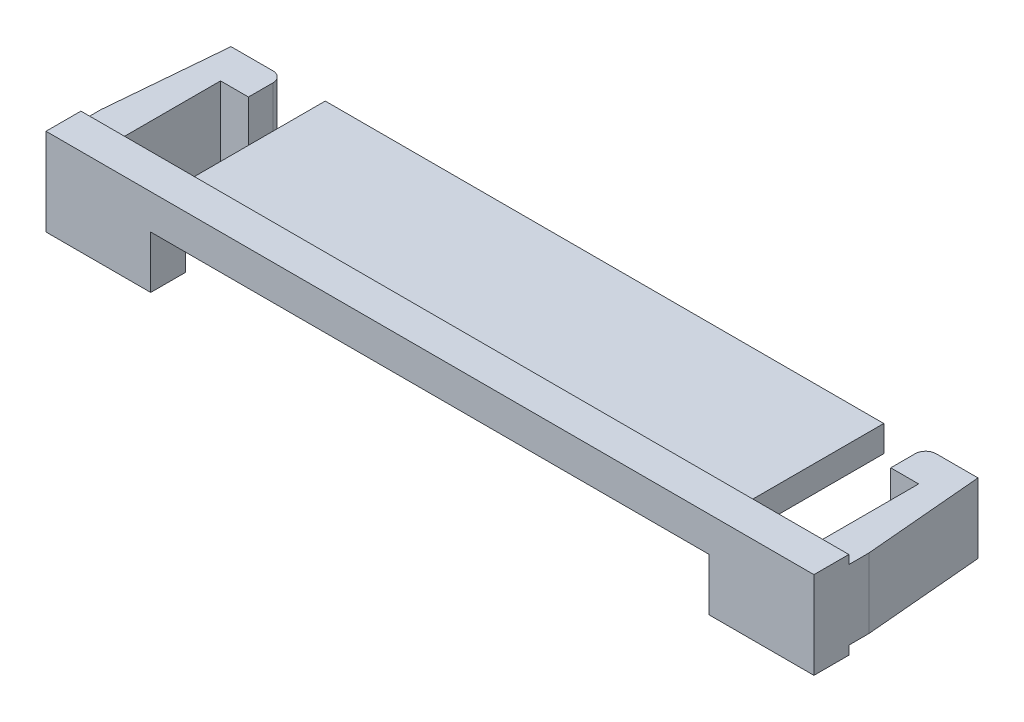
ISO-10303-21;
HEADER;
FILE_DESCRIPTION(('STEP AP214'),'2;1');
FILE_NAME('part.step','',(''),(''),'','','');
FILE_SCHEMA(('AUTOMOTIVE_DESIGN { 1 0 10303 214 1 1 1 1 }'));
ENDSEC;
DATA;
#1=APPLICATION_CONTEXT('core data for automotive mechanical design processes');
#2=APPLICATION_PROTOCOL_DEFINITION('international standard','automotive_design',2000,#1);
#3=PRODUCT_CONTEXT('',#1,'mechanical');
#4=PRODUCT('Part','Part','',(#3));
#5=PRODUCT_RELATED_PRODUCT_CATEGORY('part','',(#4));
#6=PRODUCT_DEFINITION_FORMATION('','',#4);
#7=PRODUCT_DEFINITION_CONTEXT('part definition',#1,'design');
#8=PRODUCT_DEFINITION('design','',#6,#7);
#9=PRODUCT_DEFINITION_SHAPE('','',#8);
#10=(LENGTH_UNIT() NAMED_UNIT(*) SI_UNIT(.MILLI.,.METRE.));
#11=(NAMED_UNIT(*) PLANE_ANGLE_UNIT() SI_UNIT($,.RADIAN.));
#12=(NAMED_UNIT(*) SI_UNIT($,.STERADIAN.) SOLID_ANGLE_UNIT());
#13=UNCERTAINTY_MEASURE_WITH_UNIT(LENGTH_MEASURE(1.E-05),#10,'distance_accuracy_value','');
#14=(GEOMETRIC_REPRESENTATION_CONTEXT(3) GLOBAL_UNCERTAINTY_ASSIGNED_CONTEXT((#13)) GLOBAL_UNIT_ASSIGNED_CONTEXT((#10,
#11,#12)) REPRESENTATION_CONTEXT('',''));
#15=CARTESIAN_POINT('',(0.,0.,0.));
#16=DIRECTION('',(0.,0.,1.));
#17=DIRECTION('',(1.,0.,0.));
#18=AXIS2_PLACEMENT_3D('',#15,#16,#17);
#19=CARTESIAN_POINT('',(-11.,-1.25,5.));
#20=DIRECTION('',(0.,1.,0.));
#21=DIRECTION('',(0.,0.,1.));
#22=AXIS2_PLACEMENT_3D('',#19,#20,#21);
#23=PLANE('',#22);
#24=DIRECTION('',(1.,0.,0.));
#25=VECTOR('',#24,1.);
#26=CARTESIAN_POINT('',(-11.,-1.25,5.));
#27=LINE('',#26,#25);
#28=CARTESIAN_POINT('',(8.,-1.25,5.));
#29=VERTEX_POINT('',#28);
#30=CARTESIAN_POINT('',(11.,-1.25,5.));
#31=VERTEX_POINT('',#30);
#32=EDGE_CURVE('E419',#29,#31,#27,.T.);
#33=ORIENTED_EDGE('',*,*,#32,.F.);
#34=DIRECTION('',(0.,0.,-1.));
#35=VECTOR('',#34,1.);
#36=CARTESIAN_POINT('',(8.,-1.25,5.));
#37=LINE('',#36,#35);
#38=CARTESIAN_POINT('',(8.,-1.25,4.));
#39=VERTEX_POINT('',#38);
#40=EDGE_CURVE('E290',#29,#39,#37,.T.);
#41=ORIENTED_EDGE('',*,*,#40,.T.);
#42=DIRECTION('',(-1.,0.,0.));
#43=VECTOR('',#42,1.);
#44=CARTESIAN_POINT('',(-11.,-1.25,4.));
#45=LINE('',#44,#43);
#46=CARTESIAN_POINT('',(11.,-1.25,4.));
#47=VERTEX_POINT('',#46);
#48=EDGE_CURVE('E397',#47,#39,#45,.T.);
#49=ORIENTED_EDGE('',*,*,#48,.F.);
#50=DIRECTION('',(0.,0.,-1.));
#51=VECTOR('',#50,1.);
#52=CARTESIAN_POINT('',(11.,-1.25,5.));
#53=LINE('',#52,#51);
#54=EDGE_CURVE('E424',#31,#47,#53,.T.);
#55=ORIENTED_EDGE('',*,*,#54,.F.);
#56=EDGE_LOOP('',(#33,#41,#49,#55));
#57=FACE_BOUND('',#56,.T.);
#58=ADVANCED_FACE('F43',(#57),#23,.F.);
#59=CARTESIAN_POINT('',(0.,0.,0.));
#60=DIRECTION('',(0.,0.,1.));
#61=DIRECTION('',(1.,0.,0.));
#62=AXIS2_PLACEMENT_3D('',#59,#60,#61);
#63=PLANE('',#62);
#64=DIRECTION('',(-1.,0.,0.));
#65=VECTOR('',#64,1.);
#66=CARTESIAN_POINT('',(11.,1.,0.));
#67=LINE('',#66,#65);
#68=CARTESIAN_POINT('',(10.7,1.,0.));
#69=VERTEX_POINT('',#68);
#70=CARTESIAN_POINT('',(9.5,1.,0.));
#71=VERTEX_POINT('',#70);
#72=EDGE_CURVE('E358',#69,#71,#67,.T.);
#73=ORIENTED_EDGE('',*,*,#72,.F.);
#74=DIRECTION('',(0.,-1.,0.));
#75=VECTOR('',#74,1.);
#76=CARTESIAN_POINT('',(10.7,0.,0.));
#77=LINE('',#76,#75);
#78=CARTESIAN_POINT('',(10.7,-1.,0.));
#79=VERTEX_POINT('',#78);
#80=EDGE_CURVE('E483',#69,#79,#77,.T.);
#81=ORIENTED_EDGE('',*,*,#80,.T.);
#82=DIRECTION('',(1.,0.,0.));
#83=VECTOR('',#82,1.);
#84=CARTESIAN_POINT('',(-11.,-1.,0.));
#85=LINE('',#84,#83);
#86=CARTESIAN_POINT('',(9.5,-1.,0.));
#87=VERTEX_POINT('',#86);
#88=EDGE_CURVE('E326',#87,#79,#85,.T.);
#89=ORIENTED_EDGE('',*,*,#88,.F.);
#90=DIRECTION('',(0.,1.,0.));
#91=VECTOR('',#90,1.);
#92=CARTESIAN_POINT('',(9.5,1.,0.));
#93=LINE('',#92,#91);
#94=EDGE_CURVE('E451',#87,#71,#93,.T.);
#95=ORIENTED_EDGE('',*,*,#94,.T.);
#96=EDGE_LOOP('',(#73,#81,#89,#95));
#97=FACE_BOUND('',#96,.T.);
#98=ADVANCED_FACE('F585',(#97),#63,.F.);
#99=CARTESIAN_POINT('',(-10.7,-1.,0.));
#100=VERTEX_POINT('',#99);
#101=CARTESIAN_POINT('',(-9.5,-1.,0.));
#102=VERTEX_POINT('',#101);
#103=EDGE_CURVE('E388',#100,#102,#85,.T.);
#104=ORIENTED_EDGE('',*,*,#103,.F.);
#105=DIRECTION('',(0.,1.,0.));
#106=VECTOR('',#105,1.);
#107=CARTESIAN_POINT('',(-10.7,0.,0.));
#108=LINE('',#107,#106);
#109=CARTESIAN_POINT('',(-10.7,1.,0.));
#110=VERTEX_POINT('',#109);
#111=EDGE_CURVE('E52',#100,#110,#108,.T.);
#112=ORIENTED_EDGE('',*,*,#111,.T.);
#113=CARTESIAN_POINT('',(-9.5,1.,0.));
#114=VERTEX_POINT('',#113);
#115=EDGE_CURVE('E374',#114,#110,#67,.T.);
#116=ORIENTED_EDGE('',*,*,#115,.F.);
#117=DIRECTION('',(0.,1.,0.));
#118=VECTOR('',#117,1.);
#119=CARTESIAN_POINT('',(-9.5,-1.,0.));
#120=LINE('',#119,#118);
#121=EDGE_CURVE('E469',#114,#102,#120,.F.);
#122=ORIENTED_EDGE('',*,*,#121,.T.);
#123=EDGE_LOOP('',(#104,#112,#116,#122));
#124=FACE_BOUND('',#123,.T.);
#125=ADVANCED_FACE('F590',(#124),#63,.F.);
#126=CARTESIAN_POINT('',(-11.,-1.,4.));
#127=DIRECTION('',(0.,1.,0.));
#128=DIRECTION('',(-1.,0.,0.));
#129=AXIS2_PLACEMENT_3D('',#126,#127,#128);
#130=PLANE('',#129);
#131=ORIENTED_EDGE('',*,*,#88,.T.);
#132=DIRECTION('',(-0.0871557427476589,0.,-0.996194698091746));
#133=VECTOR('',#132,1.);
#134=CARTESIAN_POINT('',(11.,-1.,3.42901569082837));
#135=LINE('',#134,#133);
#136=CARTESIAN_POINT('',(11.,-1.,3.42901569082837));
#137=VERTEX_POINT('',#136);
#138=EDGE_CURVE('E486',#79,#137,#135,.F.);
#139=ORIENTED_EDGE('',*,*,#138,.T.);
#140=DIRECTION('',(0.,0.,-1.));
#141=VECTOR('',#140,1.);
#142=CARTESIAN_POINT('',(11.,-1.,4.));
#143=LINE('',#142,#141);
#144=CARTESIAN_POINT('',(11.,-1.,4.));
#145=VERTEX_POINT('',#144);
#146=EDGE_CURVE('E404',#145,#137,#143,.T.);
#147=ORIENTED_EDGE('',*,*,#146,.F.);
#148=DIRECTION('',(1.,0.,0.));
#149=VECTOR('',#148,1.);
#150=CARTESIAN_POINT('',(-11.,-1.,4.));
#151=LINE('',#150,#149);
#152=CARTESIAN_POINT('',(10.,-1.,4.));
#153=VERTEX_POINT('',#152);
#154=EDGE_CURVE('E387',#153,#145,#151,.T.);
#155=ORIENTED_EDGE('',*,*,#154,.F.);
#156=DIRECTION('',(0.,0.,-1.));
#157=VECTOR('',#156,1.);
#158=CARTESIAN_POINT('',(10.,-1.,4.));
#159=LINE('',#158,#157);
#160=CARTESIAN_POINT('',(10.,-1.,1.));
#161=VERTEX_POINT('',#160);
#162=EDGE_CURVE('E249',#153,#161,#159,.T.);
#163=ORIENTED_EDGE('',*,*,#162,.T.);
#164=DIRECTION('',(1.,0.,0.));
#165=VECTOR('',#164,1.);
#166=CARTESIAN_POINT('',(11.,-1.,1.));
#167=LINE('',#166,#165);
#168=CARTESIAN_POINT('',(9.2,-1.,1.));
#169=VERTEX_POINT('',#168);
#170=EDGE_CURVE('E234',#169,#161,#167,.T.);
#171=ORIENTED_EDGE('',*,*,#170,.F.);
#172=DIRECTION('',(0.,0.,1.));
#173=VECTOR('',#172,1.);
#174=CARTESIAN_POINT('',(9.2,-1.,0.));
#175=LINE('',#174,#173);
#176=CARTESIAN_POINT('',(9.2,-1.,0.3));
#177=VERTEX_POINT('',#176);
#178=EDGE_CURVE('E222',#177,#169,#175,.T.);
#179=ORIENTED_EDGE('',*,*,#178,.F.);
#180=CARTESIAN_POINT('',(9.5,-1.,0.3));
#181=DIRECTION('',(0.,1.,0.));
#182=DIRECTION('',(-1.,0.,0.));
#183=AXIS2_PLACEMENT_3D('',#180,#181,#182);
#184=CIRCLE('',#183,0.3);
#185=EDGE_CURVE('E460',#177,#87,#184,.F.);
#186=ORIENTED_EDGE('',*,*,#185,.T.);
#187=EDGE_LOOP('',(#131,#139,#147,#155,#163,#171,#179,#186));
#188=FACE_BOUND('',#187,.T.);
#189=ADVANCED_FACE('F247',(#188),#130,.F.);
#190=DIRECTION('',(0.,0.,-1.));
#191=VECTOR('',#190,1.);
#192=CARTESIAN_POINT('',(-11.,-1.,4.));
#193=LINE('',#192,#191);
#194=CARTESIAN_POINT('',(-11.,-1.,4.));
#195=VERTEX_POINT('',#194);
#196=CARTESIAN_POINT('',(-11.,-1.,3.42901569082837));
#197=VERTEX_POINT('',#196);
#198=EDGE_CURVE('E401',#195,#197,#193,.T.);
#199=ORIENTED_EDGE('',*,*,#198,.T.);
#200=DIRECTION('',(-0.0871557427476589,0.,0.996194698091746));
#201=VECTOR('',#200,1.);
#202=CARTESIAN_POINT('',(-11.,-1.,3.42901569082837));
#203=LINE('',#202,#201);
#204=EDGE_CURVE('E66',#197,#100,#203,.F.);
#205=ORIENTED_EDGE('',*,*,#204,.T.);
#206=ORIENTED_EDGE('',*,*,#103,.T.);
#207=CARTESIAN_POINT('',(-9.5,-1.,0.3));
#208=DIRECTION('',(0.,1.,0.));
#209=DIRECTION('',(-1.,0.,0.));
#210=AXIS2_PLACEMENT_3D('',#207,#208,#209);
#211=CIRCLE('',#210,0.3);
#212=CARTESIAN_POINT('',(-9.2,-1.,0.3));
#213=VERTEX_POINT('',#212);
#214=EDGE_CURVE('E473',#102,#213,#211,.F.);
#215=ORIENTED_EDGE('',*,*,#214,.T.);
#216=DIRECTION('',(0.,0.,-1.));
#217=VECTOR('',#216,1.);
#218=CARTESIAN_POINT('',(-9.2,-1.,0.));
#219=LINE('',#218,#217);
#220=CARTESIAN_POINT('',(-9.2,-1.,1.));
#221=VERTEX_POINT('',#220);
#222=EDGE_CURVE('E263',#221,#213,#219,.T.);
#223=ORIENTED_EDGE('',*,*,#222,.F.);
#224=DIRECTION('',(1.,0.,0.));
#225=VECTOR('',#224,1.);
#226=CARTESIAN_POINT('',(-11.,-1.,1.));
#227=LINE('',#226,#225);
#228=CARTESIAN_POINT('',(-9.99999999999999,-1.,1.));
#229=VERTEX_POINT('',#228);
#230=EDGE_CURVE('E260',#229,#221,#227,.T.);
#231=ORIENTED_EDGE('',*,*,#230,.F.);
#232=DIRECTION('',(0.,0.,-1.));
#233=VECTOR('',#232,1.);
#234=CARTESIAN_POINT('',(-9.99999999999999,-1.,4.));
#235=LINE('',#234,#233);
#236=CARTESIAN_POINT('',(-9.99999999999999,-1.,4.));
#237=VERTEX_POINT('',#236);
#238=EDGE_CURVE('E322',#237,#229,#235,.T.);
#239=ORIENTED_EDGE('',*,*,#238,.F.);
#240=EDGE_CURVE('E389',#195,#237,#151,.T.);
#241=ORIENTED_EDGE('',*,*,#240,.F.);
#242=EDGE_LOOP('',(#199,#205,#206,#215,#223,#231,#239,#241));
#243=FACE_BOUND('',#242,.T.);
#244=ADVANCED_FACE('F552',(#243),#130,.F.);
#245=CARTESIAN_POINT('',(11.,1.,4.));
#246=DIRECTION('',(0.,-1.,0.));
#247=DIRECTION('',(0.,0.,-1.));
#248=AXIS2_PLACEMENT_3D('',#245,#246,#247);
#249=PLANE('',#248);
#250=DIRECTION('',(0.,0.,-1.));
#251=VECTOR('',#250,1.);
#252=CARTESIAN_POINT('',(11.,1.,4.));
#253=LINE('',#252,#251);
#254=CARTESIAN_POINT('',(11.,1.,4.));
#255=VERTEX_POINT('',#254);
#256=CARTESIAN_POINT('',(11.,1.,3.42901569082837));
#257=VERTEX_POINT('',#256);
#258=EDGE_CURVE('E370',#255,#257,#253,.T.);
#259=ORIENTED_EDGE('',*,*,#258,.T.);
#260=DIRECTION('',(0.0871557427476589,0.,0.996194698091746));
#261=VECTOR('',#260,1.);
#262=CARTESIAN_POINT('',(11.,1.,3.42901569082837));
#263=LINE('',#262,#261);
#264=EDGE_CURVE('E480',#257,#69,#263,.F.);
#265=ORIENTED_EDGE('',*,*,#264,.T.);
#266=ORIENTED_EDGE('',*,*,#72,.T.);
#267=CARTESIAN_POINT('',(9.5,1.,0.3));
#268=DIRECTION('',(0.,-1.,0.));
#269=DIRECTION('',(0.,0.,-1.));
#270=AXIS2_PLACEMENT_3D('',#267,#268,#269);
#271=CIRCLE('',#270,0.3);
#272=CARTESIAN_POINT('',(9.2,1.,0.3));
#273=VERTEX_POINT('',#272);
#274=EDGE_CURVE('E455',#71,#273,#271,.F.);
#275=ORIENTED_EDGE('',*,*,#274,.T.);
#276=DIRECTION('',(0.,0.,1.));
#277=VECTOR('',#276,1.);
#278=CARTESIAN_POINT('',(9.2,1.,0.));
#279=LINE('',#278,#277);
#280=CARTESIAN_POINT('',(9.2,1.,1.));
#281=VERTEX_POINT('',#280);
#282=EDGE_CURVE('E255',#273,#281,#279,.T.);
#283=ORIENTED_EDGE('',*,*,#282,.T.);
#284=DIRECTION('',(1.,0.,0.));
#285=VECTOR('',#284,1.);
#286=CARTESIAN_POINT('',(11.,1.,1.));
#287=LINE('',#286,#285);
#288=CARTESIAN_POINT('',(10.,1.,1.));
#289=VERTEX_POINT('',#288);
#290=EDGE_CURVE('E235',#281,#289,#287,.T.);
#291=ORIENTED_EDGE('',*,*,#290,.T.);
#292=DIRECTION('',(0.,0.,-1.));
#293=VECTOR('',#292,1.);
#294=CARTESIAN_POINT('',(10.,1.,4.));
#295=LINE('',#294,#293);
#296=CARTESIAN_POINT('',(10.,1.,4.));
#297=VERTEX_POINT('',#296);
#298=EDGE_CURVE('E323',#297,#289,#295,.T.);
#299=ORIENTED_EDGE('',*,*,#298,.F.);
#300=DIRECTION('',(-1.,0.,0.));
#301=VECTOR('',#300,1.);
#302=CARTESIAN_POINT('',(11.,1.,4.));
#303=LINE('',#302,#301);
#304=EDGE_CURVE('E359',#255,#297,#303,.T.);
#305=ORIENTED_EDGE('',*,*,#304,.F.);
#306=EDGE_LOOP('',(#259,#265,#266,#275,#283,#291,#299,#305));
#307=FACE_BOUND('',#306,.T.);
#308=ADVANCED_FACE('F574',(#307),#249,.F.);
#309=ORIENTED_EDGE('',*,*,#115,.T.);
#310=DIRECTION('',(0.0871557427476589,0.,-0.996194698091746));
#311=VECTOR('',#310,1.);
#312=CARTESIAN_POINT('',(-11.,1.,3.42901569082837));
#313=LINE('',#312,#311);
#314=CARTESIAN_POINT('',(-11.,1.,3.42901569082837));
#315=VERTEX_POINT('',#314);
#316=EDGE_CURVE('E11',#110,#315,#313,.F.);
#317=ORIENTED_EDGE('',*,*,#316,.T.);
#318=DIRECTION('',(0.,0.,-1.));
#319=VECTOR('',#318,1.);
#320=CARTESIAN_POINT('',(-11.,1.,4.));
#321=LINE('',#320,#319);
#322=CARTESIAN_POINT('',(-11.,1.,4.));
#323=VERTEX_POINT('',#322);
#324=EDGE_CURVE('E375',#323,#315,#321,.T.);
#325=ORIENTED_EDGE('',*,*,#324,.F.);
#326=CARTESIAN_POINT('',(-9.99999999999999,1.,4.));
#327=VERTEX_POINT('',#326);
#328=EDGE_CURVE('E357',#327,#323,#303,.T.);
#329=ORIENTED_EDGE('',*,*,#328,.F.);
#330=DIRECTION('',(0.,0.,-1.));
#331=VECTOR('',#330,1.);
#332=CARTESIAN_POINT('',(-9.99999999999999,1.,4.));
#333=LINE('',#332,#331);
#334=CARTESIAN_POINT('',(-9.99999999999999,1.,1.));
#335=VERTEX_POINT('',#334);
#336=EDGE_CURVE('E340',#327,#335,#333,.T.);
#337=ORIENTED_EDGE('',*,*,#336,.T.);
#338=DIRECTION('',(1.,0.,0.));
#339=VECTOR('',#338,1.);
#340=CARTESIAN_POINT('',(-11.,1.,1.));
#341=LINE('',#340,#339);
#342=CARTESIAN_POINT('',(-9.2,1.,1.));
#343=VERTEX_POINT('',#342);
#344=EDGE_CURVE('E243',#335,#343,#341,.T.);
#345=ORIENTED_EDGE('',*,*,#344,.T.);
#346=DIRECTION('',(0.,0.,-1.));
#347=VECTOR('',#346,1.);
#348=CARTESIAN_POINT('',(-9.2,1.,0.));
#349=LINE('',#348,#347);
#350=CARTESIAN_POINT('',(-9.2,1.,0.3));
#351=VERTEX_POINT('',#350);
#352=EDGE_CURVE('E264',#343,#351,#349,.T.);
#353=ORIENTED_EDGE('',*,*,#352,.T.);
#354=CARTESIAN_POINT('',(-9.5,1.,0.3));
#355=DIRECTION('',(0.,-1.,0.));
#356=DIRECTION('',(0.,0.,-1.));
#357=AXIS2_PLACEMENT_3D('',#354,#355,#356);
#358=CIRCLE('',#357,0.3);
#359=EDGE_CURVE('E466',#351,#114,#358,.F.);
#360=ORIENTED_EDGE('',*,*,#359,.T.);
#361=EDGE_LOOP('',(#309,#317,#325,#329,#337,#345,#353,#360));
#362=FACE_BOUND('',#361,.T.);
#363=ADVANCED_FACE('F560',(#362),#249,.F.);
#364=CARTESIAN_POINT('',(-11.,1.25,5.));
#365=DIRECTION('',(0.,-1.,0.));
#366=DIRECTION('',(0.,0.,-1.));
#367=AXIS2_PLACEMENT_3D('',#364,#365,#366);
#368=PLANE('',#367);
#369=DIRECTION('',(1.,0.,0.));
#370=VECTOR('',#369,1.);
#371=CARTESIAN_POINT('',(11.,1.25,4.));
#372=LINE('',#371,#370);
#373=CARTESIAN_POINT('',(-11.,1.25,4.));
#374=VERTEX_POINT('',#373);
#375=CARTESIAN_POINT('',(11.,1.25,4.));
#376=VERTEX_POINT('',#375);
#377=EDGE_CURVE('E367',#374,#376,#372,.T.);
#378=ORIENTED_EDGE('',*,*,#377,.F.);
#379=DIRECTION('',(0.,0.,-1.));
#380=VECTOR('',#379,1.);
#381=CARTESIAN_POINT('',(-11.,1.25,5.));
#382=LINE('',#381,#380);
#383=CARTESIAN_POINT('',(-11.,1.25,5.));
#384=VERTEX_POINT('',#383);
#385=EDGE_CURVE('E432',#384,#374,#382,.T.);
#386=ORIENTED_EDGE('',*,*,#385,.F.);
#387=DIRECTION('',(-1.,0.,0.));
#388=VECTOR('',#387,1.);
#389=CARTESIAN_POINT('',(-11.,1.25,5.));
#390=LINE('',#389,#388);
#391=CARTESIAN_POINT('',(11.,1.25,5.));
#392=VERTEX_POINT('',#391);
#393=EDGE_CURVE('E413',#392,#384,#390,.T.);
#394=ORIENTED_EDGE('',*,*,#393,.F.);
#395=DIRECTION('',(0.,0.,-1.));
#396=VECTOR('',#395,1.);
#397=CARTESIAN_POINT('',(11.,1.25,5.));
#398=LINE('',#397,#396);
#399=EDGE_CURVE('E436',#392,#376,#398,.T.);
#400=ORIENTED_EDGE('',*,*,#399,.T.);
#401=EDGE_LOOP('',(#378,#386,#394,#400));
#402=FACE_BOUND('',#401,.T.);
#403=ADVANCED_FACE('F566',(#402),#368,.F.);
#404=CARTESIAN_POINT('',(-7.99999999999999,-1.25,4.));
#405=VERTEX_POINT('',#404);
#406=CARTESIAN_POINT('',(-11.,-1.25,4.));
#407=VERTEX_POINT('',#406);
#408=EDGE_CURVE('E396',#405,#407,#45,.T.);
#409=ORIENTED_EDGE('',*,*,#408,.F.);
#410=DIRECTION('',(0.,0.,-1.));
#411=VECTOR('',#410,1.);
#412=CARTESIAN_POINT('',(-7.99999999999999,-1.25,5.));
#413=LINE('',#412,#411);
#414=CARTESIAN_POINT('',(-7.99999999999999,-1.25,5.));
#415=VERTEX_POINT('',#414);
#416=EDGE_CURVE('E303',#415,#405,#413,.T.);
#417=ORIENTED_EDGE('',*,*,#416,.F.);
#418=CARTESIAN_POINT('',(-11.,-1.25,5.));
#419=VERTEX_POINT('',#418);
#420=EDGE_CURVE('E420',#419,#415,#27,.T.);
#421=ORIENTED_EDGE('',*,*,#420,.F.);
#422=DIRECTION('',(0.,0.,-1.));
#423=VECTOR('',#422,1.);
#424=CARTESIAN_POINT('',(-11.,-1.25,5.));
#425=LINE('',#424,#423);
#426=EDGE_CURVE('E428',#419,#407,#425,.T.);
#427=ORIENTED_EDGE('',*,*,#426,.T.);
#428=EDGE_LOOP('',(#409,#417,#421,#427));
#429=FACE_BOUND('',#428,.T.);
#430=ADVANCED_FACE('F544',(#429),#23,.F.);
#431=CARTESIAN_POINT('',(11.,1.25,5.));
#432=DIRECTION('',(-1.,0.,0.));
#433=DIRECTION('',(0.,0.,1.));
#434=AXIS2_PLACEMENT_3D('',#431,#432,#433);
#435=PLANE('',#434);
#436=ORIENTED_EDGE('',*,*,#146,.T.);
#437=DIRECTION('',(0.,1.,0.));
#438=VECTOR('',#437,1.);
#439=CARTESIAN_POINT('',(11.,1.25,3.42901569082837));
#440=LINE('',#439,#438);
#441=EDGE_CURVE('E476',#137,#257,#440,.T.);
#442=ORIENTED_EDGE('',*,*,#441,.T.);
#443=ORIENTED_EDGE('',*,*,#258,.F.);
#444=DIRECTION('',(0.,-1.,0.));
#445=VECTOR('',#444,1.);
#446=CARTESIAN_POINT('',(11.,1.25,4.));
#447=LINE('',#446,#445);
#448=EDGE_CURVE('E353',#376,#255,#447,.T.);
#449=ORIENTED_EDGE('',*,*,#448,.F.);
#450=ORIENTED_EDGE('',*,*,#399,.F.);
#451=DIRECTION('',(0.,1.,0.));
#452=VECTOR('',#451,1.);
#453=CARTESIAN_POINT('',(11.,1.25,5.));
#454=LINE('',#453,#452);
#455=EDGE_CURVE('E379',#31,#392,#454,.T.);
#456=ORIENTED_EDGE('',*,*,#455,.F.);
#457=ORIENTED_EDGE('',*,*,#54,.T.);
#458=DIRECTION('',(0.,-1.,0.));
#459=VECTOR('',#458,1.);
#460=CARTESIAN_POINT('',(11.,-1.25,4.));
#461=LINE('',#460,#459);
#462=EDGE_CURVE('E393',#145,#47,#461,.T.);
#463=ORIENTED_EDGE('',*,*,#462,.F.);
#464=EDGE_LOOP('',(#436,#442,#443,#449,#450,#456,#457,#463));
#465=FACE_BOUND('',#464,.T.);
#466=ADVANCED_FACE('F570',(#465),#435,.F.);
#467=CARTESIAN_POINT('',(-11.,1.25,5.));
#468=DIRECTION('',(1.,0.,0.));
#469=DIRECTION('',(0.,0.,-1.));
#470=AXIS2_PLACEMENT_3D('',#467,#468,#469);
#471=PLANE('',#470);
#472=ORIENTED_EDGE('',*,*,#324,.T.);
#473=DIRECTION('',(0.,-1.,0.));
#474=VECTOR('',#473,1.);
#475=CARTESIAN_POINT('',(-11.,1.25,3.42901569082837));
#476=LINE('',#475,#474);
#477=EDGE_CURVE('E489',#315,#197,#476,.T.);
#478=ORIENTED_EDGE('',*,*,#477,.T.);
#479=ORIENTED_EDGE('',*,*,#198,.F.);
#480=DIRECTION('',(0.,1.,0.));
#481=VECTOR('',#480,1.);
#482=CARTESIAN_POINT('',(-11.,-1.25,4.));
#483=LINE('',#482,#481);
#484=EDGE_CURVE('E383',#407,#195,#483,.T.);
#485=ORIENTED_EDGE('',*,*,#484,.F.);
#486=ORIENTED_EDGE('',*,*,#426,.F.);
#487=DIRECTION('',(0.,-1.,0.));
#488=VECTOR('',#487,1.);
#489=CARTESIAN_POINT('',(-11.,1.25,5.));
#490=LINE('',#489,#488);
#491=EDGE_CURVE('E416',#384,#419,#490,.T.);
#492=ORIENTED_EDGE('',*,*,#491,.F.);
#493=ORIENTED_EDGE('',*,*,#385,.T.);
#494=DIRECTION('',(0.,1.,0.));
#495=VECTOR('',#494,1.);
#496=CARTESIAN_POINT('',(-11.,1.25,4.));
#497=LINE('',#496,#495);
#498=EDGE_CURVE('E363',#323,#374,#497,.T.);
#499=ORIENTED_EDGE('',*,*,#498,.F.);
#500=EDGE_LOOP('',(#472,#478,#479,#485,#486,#492,#493,#499));
#501=FACE_BOUND('',#500,.T.);
#502=ADVANCED_FACE('F549',(#501),#471,.F.);
#503=CARTESIAN_POINT('',(0.,0.,5.));
#504=DIRECTION('',(0.,0.,1.));
#505=DIRECTION('',(1.,0.,0.));
#506=AXIS2_PLACEMENT_3D('',#503,#504,#505);
#507=PLANE('',#506);
#508=DIRECTION('',(0.,-1.,0.));
#509=VECTOR('',#508,1.);
#510=CARTESIAN_POINT('',(8.,0.25,5.));
#511=LINE('',#510,#509);
#512=CARTESIAN_POINT('',(8.,0.25,5.));
#513=VERTEX_POINT('',#512);
#514=EDGE_CURVE('E278',#513,#29,#511,.T.);
#515=ORIENTED_EDGE('',*,*,#514,.T.);
#516=ORIENTED_EDGE('',*,*,#32,.T.);
#517=ORIENTED_EDGE('',*,*,#455,.T.);
#518=ORIENTED_EDGE('',*,*,#393,.T.);
#519=ORIENTED_EDGE('',*,*,#491,.T.);
#520=ORIENTED_EDGE('',*,*,#420,.T.);
#521=DIRECTION('',(0.,1.,0.));
#522=VECTOR('',#521,1.);
#523=CARTESIAN_POINT('',(-7.99999999999999,0.25,5.));
#524=LINE('',#523,#522);
#525=CARTESIAN_POINT('',(-7.99999999999999,0.25,5.));
#526=VERTEX_POINT('',#525);
#527=EDGE_CURVE('E282',#415,#526,#524,.T.);
#528=ORIENTED_EDGE('',*,*,#527,.T.);
#529=DIRECTION('',(1.,0.,0.));
#530=VECTOR('',#529,1.);
#531=CARTESIAN_POINT('',(8.,0.25,5.));
#532=LINE('',#531,#530);
#533=EDGE_CURVE('E286',#526,#513,#532,.T.);
#534=ORIENTED_EDGE('',*,*,#533,.T.);
#535=EDGE_LOOP('',(#515,#516,#517,#518,#519,#520,#528,#534));
#536=FACE_BOUND('',#535,.T.);
#537=ADVANCED_FACE('F537',(#536),#507,.T.);
#538=DIRECTION('',(0.,1.,0.));
#539=VECTOR('',#538,1.);
#540=CARTESIAN_POINT('',(8.,1.,0.));
#541=LINE('',#540,#539);
#542=CARTESIAN_POINT('',(8.,0.25,0.));
#543=VERTEX_POINT('',#542);
#544=CARTESIAN_POINT('',(8.,1.,0.));
#545=VERTEX_POINT('',#544);
#546=EDGE_CURVE('E315',#543,#545,#541,.T.);
#547=ORIENTED_EDGE('',*,*,#546,.F.);
#548=DIRECTION('',(1.,0.,0.));
#549=VECTOR('',#548,1.);
#550=CARTESIAN_POINT('',(8.,0.25,0.));
#551=LINE('',#550,#549);
#552=CARTESIAN_POINT('',(-7.99999999999999,0.25,0.));
#553=VERTEX_POINT('',#552);
#554=EDGE_CURVE('E277',#553,#543,#551,.T.);
#555=ORIENTED_EDGE('',*,*,#554,.F.);
#556=DIRECTION('',(0.,-1.,0.));
#557=VECTOR('',#556,1.);
#558=CARTESIAN_POINT('',(-7.99999999999999,1.,0.));
#559=LINE('',#558,#557);
#560=CARTESIAN_POINT('',(-7.99999999999999,1.,0.));
#561=VERTEX_POINT('',#560);
#562=EDGE_CURVE('E297',#561,#553,#559,.T.);
#563=ORIENTED_EDGE('',*,*,#562,.F.);
#564=EDGE_CURVE('E373',#545,#561,#67,.T.);
#565=ORIENTED_EDGE('',*,*,#564,.F.);
#566=EDGE_LOOP('',(#547,#555,#563,#565));
#567=FACE_BOUND('',#566,.T.);
#568=ADVANCED_FACE('F518',(#567),#63,.F.);
#569=CARTESIAN_POINT('',(8.,1.,4.));
#570=VERTEX_POINT('',#569);
#571=CARTESIAN_POINT('',(-7.99999999999999,1.,4.));
#572=VERTEX_POINT('',#571);
#573=EDGE_CURVE('E364',#570,#572,#303,.T.);
#574=ORIENTED_EDGE('',*,*,#573,.F.);
#575=DIRECTION('',(0.,0.,-1.));
#576=VECTOR('',#575,1.);
#577=CARTESIAN_POINT('',(8.,1.,4.));
#578=LINE('',#577,#576);
#579=EDGE_CURVE('E327',#570,#545,#578,.T.);
#580=ORIENTED_EDGE('',*,*,#579,.T.);
#581=ORIENTED_EDGE('',*,*,#564,.T.);
#582=DIRECTION('',(0.,0.,-1.));
#583=VECTOR('',#582,1.);
#584=CARTESIAN_POINT('',(-7.99999999999999,1.,4.));
#585=LINE('',#584,#583);
#586=EDGE_CURVE('E347',#572,#561,#585,.T.);
#587=ORIENTED_EDGE('',*,*,#586,.F.);
#588=EDGE_LOOP('',(#574,#580,#581,#587));
#589=FACE_BOUND('',#588,.T.);
#590=ADVANCED_FACE('F513',(#589),#249,.F.);
#591=CARTESIAN_POINT('',(0.,0.,4.));
#592=DIRECTION('',(0.,0.,-1.));
#593=DIRECTION('',(-1.,0.,0.));
#594=AXIS2_PLACEMENT_3D('',#591,#592,#593);
#595=PLANE('',#594);
#596=ORIENTED_EDGE('',*,*,#48,.T.);
#597=DIRECTION('',(0.,1.,0.));
#598=VECTOR('',#597,1.);
#599=CARTESIAN_POINT('',(8.,1.,4.));
#600=LINE('',#599,#598);
#601=CARTESIAN_POINT('',(8.,0.25,4.));
#602=VERTEX_POINT('',#601);
#603=EDGE_CURVE('E316',#39,#602,#600,.T.);
#604=ORIENTED_EDGE('',*,*,#603,.T.);
#605=EDGE_CURVE('E314',#602,#570,#600,.T.);
#606=ORIENTED_EDGE('',*,*,#605,.T.);
#607=ORIENTED_EDGE('',*,*,#573,.T.);
#608=DIRECTION('',(0.,-1.,0.));
#609=VECTOR('',#608,1.);
#610=CARTESIAN_POINT('',(-7.99999999999999,1.,4.));
#611=LINE('',#610,#609);
#612=CARTESIAN_POINT('',(-7.99999999999999,0.25,4.));
#613=VERTEX_POINT('',#612);
#614=EDGE_CURVE('E336',#572,#613,#611,.T.);
#615=ORIENTED_EDGE('',*,*,#614,.T.);
#616=EDGE_CURVE('E335',#613,#405,#611,.T.);
#617=ORIENTED_EDGE('',*,*,#616,.T.);
#618=ORIENTED_EDGE('',*,*,#408,.T.);
#619=ORIENTED_EDGE('',*,*,#484,.T.);
#620=ORIENTED_EDGE('',*,*,#240,.T.);
#621=DIRECTION('',(0.,1.,0.));
#622=VECTOR('',#621,1.);
#623=CARTESIAN_POINT('',(-9.99999999999999,1.,4.));
#624=LINE('',#623,#622);
#625=EDGE_CURVE('E332',#237,#327,#624,.T.);
#626=ORIENTED_EDGE('',*,*,#625,.T.);
#627=ORIENTED_EDGE('',*,*,#328,.T.);
#628=ORIENTED_EDGE('',*,*,#498,.T.);
#629=ORIENTED_EDGE('',*,*,#377,.T.);
#630=ORIENTED_EDGE('',*,*,#448,.T.);
#631=ORIENTED_EDGE('',*,*,#304,.T.);
#632=DIRECTION('',(0.,-1.,0.));
#633=VECTOR('',#632,1.);
#634=CARTESIAN_POINT('',(10.,1.,4.));
#635=LINE('',#634,#633);
#636=EDGE_CURVE('E310',#297,#153,#635,.T.);
#637=ORIENTED_EDGE('',*,*,#636,.T.);
#638=ORIENTED_EDGE('',*,*,#154,.T.);
#639=ORIENTED_EDGE('',*,*,#462,.T.);
#640=EDGE_LOOP('',(#596,#604,#606,#607,#615,#617,#618,#619,#620,#626,#627,#628,#629,#630,#631,
#637,#638,#639));
#641=FACE_BOUND('',#640,.T.);
#642=ADVANCED_FACE('F524',(#641),#595,.T.);
#643=CARTESIAN_POINT('',(-9.99999999999999,1.,4.));
#644=DIRECTION('',(-1.,0.,0.));
#645=DIRECTION('',(0.,0.,1.));
#646=AXIS2_PLACEMENT_3D('',#643,#644,#645);
#647=PLANE('',#646);
#648=ORIENTED_EDGE('',*,*,#238,.T.);
#649=DIRECTION('',(0.,1.,0.));
#650=VECTOR('',#649,1.);
#651=CARTESIAN_POINT('',(-9.99999999999999,1.,1.));
#652=LINE('',#651,#650);
#653=EDGE_CURVE('E444',#229,#335,#652,.T.);
#654=ORIENTED_EDGE('',*,*,#653,.T.);
#655=ORIENTED_EDGE('',*,*,#336,.F.);
#656=ORIENTED_EDGE('',*,*,#625,.F.);
#657=EDGE_LOOP('',(#648,#654,#655,#656));
#658=FACE_BOUND('',#657,.T.);
#659=ADVANCED_FACE('F559',(#658),#647,.F.);
#660=CARTESIAN_POINT('',(-7.99999999999999,1.,4.));
#661=DIRECTION('',(1.,0.,0.));
#662=DIRECTION('',(0.,0.,-1.));
#663=AXIS2_PLACEMENT_3D('',#660,#661,#662);
#664=PLANE('',#663);
#665=ORIENTED_EDGE('',*,*,#562,.T.);
#666=DIRECTION('',(0.,0.,-1.));
#667=VECTOR('',#666,1.);
#668=CARTESIAN_POINT('',(-7.99999999999999,0.25,5.));
#669=LINE('',#668,#667);
#670=EDGE_CURVE('E302',#613,#553,#669,.T.);
#671=ORIENTED_EDGE('',*,*,#670,.F.);
#672=ORIENTED_EDGE('',*,*,#614,.F.);
#673=ORIENTED_EDGE('',*,*,#586,.T.);
#674=EDGE_LOOP('',(#665,#671,#672,#673));
#675=FACE_BOUND('',#674,.T.);
#676=ADVANCED_FACE('F522',(#675),#664,.F.);
#677=CARTESIAN_POINT('',(10.,1.,4.));
#678=DIRECTION('',(1.,0.,0.));
#679=DIRECTION('',(0.,0.,-1.));
#680=AXIS2_PLACEMENT_3D('',#677,#678,#679);
#681=PLANE('',#680);
#682=ORIENTED_EDGE('',*,*,#298,.T.);
#683=DIRECTION('',(0.,-1.,0.));
#684=VECTOR('',#683,1.);
#685=CARTESIAN_POINT('',(10.,1.,1.));
#686=LINE('',#685,#684);
#687=EDGE_CURVE('E448',#289,#161,#686,.T.);
#688=ORIENTED_EDGE('',*,*,#687,.T.);
#689=ORIENTED_EDGE('',*,*,#162,.F.);
#690=ORIENTED_EDGE('',*,*,#636,.F.);
#691=EDGE_LOOP('',(#682,#688,#689,#690));
#692=FACE_BOUND('',#691,.T.);
#693=ADVANCED_FACE('F576',(#692),#681,.F.);
#694=CARTESIAN_POINT('',(8.,1.,4.));
#695=DIRECTION('',(-1.,0.,0.));
#696=DIRECTION('',(0.,-1.,0.));
#697=AXIS2_PLACEMENT_3D('',#694,#695,#696);
#698=PLANE('',#697);
#699=ORIENTED_EDGE('',*,*,#605,.F.);
#700=DIRECTION('',(0.,0.,-1.));
#701=VECTOR('',#700,1.);
#702=CARTESIAN_POINT('',(8.,0.25,4.));
#703=LINE('',#702,#701);
#704=EDGE_CURVE('E440',#602,#543,#703,.T.);
#705=ORIENTED_EDGE('',*,*,#704,.T.);
#706=ORIENTED_EDGE('',*,*,#546,.T.);
#707=ORIENTED_EDGE('',*,*,#579,.F.);
#708=EDGE_LOOP('',(#699,#705,#706,#707));
#709=FACE_BOUND('',#708,.T.);
#710=ADVANCED_FACE('F528',(#709),#698,.F.);
#711=CARTESIAN_POINT('',(8.,0.25,5.));
#712=DIRECTION('',(1.,0.,0.));
#713=DIRECTION('',(0.,0.,-1.));
#714=AXIS2_PLACEMENT_3D('',#711,#712,#713);
#715=PLANE('',#714);
#716=ORIENTED_EDGE('',*,*,#603,.F.);
#717=ORIENTED_EDGE('',*,*,#40,.F.);
#718=ORIENTED_EDGE('',*,*,#514,.F.);
#719=DIRECTION('',(0.,0.,-1.));
#720=VECTOR('',#719,1.);
#721=CARTESIAN_POINT('',(8.,0.25,5.));
#722=LINE('',#721,#720);
#723=EDGE_CURVE('E293',#513,#602,#722,.T.);
#724=ORIENTED_EDGE('',*,*,#723,.T.);
#725=EDGE_LOOP('',(#716,#717,#718,#724));
#726=FACE_BOUND('',#725,.T.);
#727=ADVANCED_FACE('F534',(#726),#715,.F.);
#728=CARTESIAN_POINT('',(8.,0.25,5.));
#729=DIRECTION('',(0.,1.,0.));
#730=DIRECTION('',(0.,0.,1.));
#731=AXIS2_PLACEMENT_3D('',#728,#729,#730);
#732=PLANE('',#731);
#733=ORIENTED_EDGE('',*,*,#554,.T.);
#734=ORIENTED_EDGE('',*,*,#704,.F.);
#735=ORIENTED_EDGE('',*,*,#723,.F.);
#736=ORIENTED_EDGE('',*,*,#533,.F.);
#737=EDGE_CURVE('E298',#526,#613,#669,.T.);
#738=ORIENTED_EDGE('',*,*,#737,.T.);
#739=ORIENTED_EDGE('',*,*,#670,.T.);
#740=EDGE_LOOP('',(#733,#734,#735,#736,#738,#739));
#741=FACE_BOUND('',#740,.T.);
#742=ADVANCED_FACE('F530',(#741),#732,.F.);
#743=CARTESIAN_POINT('',(-7.99999999999999,0.25,5.));
#744=DIRECTION('',(-1.,0.,0.));
#745=DIRECTION('',(0.,-1.,0.));
#746=AXIS2_PLACEMENT_3D('',#743,#744,#745);
#747=PLANE('',#746);
#748=ORIENTED_EDGE('',*,*,#416,.T.);
#749=ORIENTED_EDGE('',*,*,#616,.F.);
#750=ORIENTED_EDGE('',*,*,#737,.F.);
#751=ORIENTED_EDGE('',*,*,#527,.F.);
#752=EDGE_LOOP('',(#748,#749,#750,#751));
#753=FACE_BOUND('',#752,.T.);
#754=ADVANCED_FACE('F539',(#753),#747,.F.);
#755=CARTESIAN_POINT('',(-11.,-1.,1.));
#756=DIRECTION('',(0.,0.,1.));
#757=DIRECTION('',(1.,0.,0.));
#758=AXIS2_PLACEMENT_3D('',#755,#756,#757);
#759=PLANE('',#758);
#760=ORIENTED_EDGE('',*,*,#653,.F.);
#761=ORIENTED_EDGE('',*,*,#230,.T.);
#762=DIRECTION('',(0.,1.,0.));
#763=VECTOR('',#762,1.);
#764=CARTESIAN_POINT('',(-9.2,-1.,1.));
#765=LINE('',#764,#763);
#766=EDGE_CURVE('E268',#221,#343,#765,.T.);
#767=ORIENTED_EDGE('',*,*,#766,.T.);
#768=ORIENTED_EDGE('',*,*,#344,.F.);
#769=EDGE_LOOP('',(#760,#761,#767,#768));
#770=FACE_BOUND('',#769,.T.);
#771=ADVANCED_FACE('F718',(#770),#759,.T.);
#772=CARTESIAN_POINT('',(-9.2,-1.,0.));
#773=DIRECTION('',(1.,0.,0.));
#774=DIRECTION('',(0.,0.,-1.));
#775=AXIS2_PLACEMENT_3D('',#772,#773,#774);
#776=PLANE('',#775);
#777=ORIENTED_EDGE('',*,*,#222,.T.);
#778=DIRECTION('',(0.,1.,0.));
#779=VECTOR('',#778,1.);
#780=CARTESIAN_POINT('',(-9.2,1.,0.3));
#781=LINE('',#780,#779);
#782=EDGE_CURVE('E462',#213,#351,#781,.T.);
#783=ORIENTED_EDGE('',*,*,#782,.T.);
#784=ORIENTED_EDGE('',*,*,#352,.F.);
#785=ORIENTED_EDGE('',*,*,#766,.F.);
#786=EDGE_LOOP('',(#777,#783,#784,#785));
#787=FACE_BOUND('',#786,.T.);
#788=ADVANCED_FACE('F713',(#787),#776,.T.);
#789=CARTESIAN_POINT('',(11.,-1.,1.));
#790=DIRECTION('',(0.,0.,1.));
#791=DIRECTION('',(1.,0.,0.));
#792=AXIS2_PLACEMENT_3D('',#789,#790,#791);
#793=PLANE('',#792);
#794=ORIENTED_EDGE('',*,*,#687,.F.);
#795=ORIENTED_EDGE('',*,*,#290,.F.);
#796=DIRECTION('',(0.,1.,0.));
#797=VECTOR('',#796,1.);
#798=CARTESIAN_POINT('',(9.2,-1.,1.));
#799=LINE('',#798,#797);
#800=EDGE_CURVE('E226',#169,#281,#799,.T.);
#801=ORIENTED_EDGE('',*,*,#800,.F.);
#802=ORIENTED_EDGE('',*,*,#170,.T.);
#803=EDGE_LOOP('',(#794,#795,#801,#802));
#804=FACE_BOUND('',#803,.T.);
#805=ADVANCED_FACE('F240',(#804),#793,.T.);
#806=CARTESIAN_POINT('',(9.2,-1.,0.));
#807=DIRECTION('',(-1.,0.,0.));
#808=DIRECTION('',(0.,0.,1.));
#809=AXIS2_PLACEMENT_3D('',#806,#807,#808);
#810=PLANE('',#809);
#811=ORIENTED_EDGE('',*,*,#282,.F.);
#812=DIRECTION('',(0.,1.,0.));
#813=VECTOR('',#812,1.);
#814=CARTESIAN_POINT('',(9.2,-1.,0.3));
#815=LINE('',#814,#813);
#816=EDGE_CURVE('E229',#273,#177,#815,.F.);
#817=ORIENTED_EDGE('',*,*,#816,.T.);
#818=ORIENTED_EDGE('',*,*,#178,.T.);
#819=ORIENTED_EDGE('',*,*,#800,.T.);
#820=EDGE_LOOP('',(#811,#817,#818,#819));
#821=FACE_BOUND('',#820,.T.);
#822=ADVANCED_FACE('F225',(#821),#810,.T.);
#823=CARTESIAN_POINT('',(9.5,0.,0.3));
#824=DIRECTION('',(0.,-1.,0.));
#825=DIRECTION('',(0.,0.,-1.));
#826=AXIS2_PLACEMENT_3D('',#823,#824,#825);
#827=CYLINDRICAL_SURFACE('',#826,0.3);
#828=ORIENTED_EDGE('',*,*,#185,.F.);
#829=ORIENTED_EDGE('',*,*,#816,.F.);
#830=ORIENTED_EDGE('',*,*,#274,.F.);
#831=ORIENTED_EDGE('',*,*,#94,.F.);
#832=EDGE_LOOP('',(#828,#829,#830,#831));
#833=FACE_BOUND('',#832,.T.);
#834=ADVANCED_FACE('F604',(#833),#827,.T.);
#835=CARTESIAN_POINT('',(-9.5,-1.,0.3));
#836=DIRECTION('',(0.,-1.,0.));
#837=DIRECTION('',(0.,0.,-1.));
#838=AXIS2_PLACEMENT_3D('',#835,#836,#837);
#839=CYLINDRICAL_SURFACE('',#838,0.3);
#840=ORIENTED_EDGE('',*,*,#214,.F.);
#841=ORIENTED_EDGE('',*,*,#121,.F.);
#842=ORIENTED_EDGE('',*,*,#359,.F.);
#843=ORIENTED_EDGE('',*,*,#782,.F.);
#844=EDGE_LOOP('',(#840,#841,#842,#843));
#845=FACE_BOUND('',#844,.T.);
#846=ADVANCED_FACE('F607',(#845),#839,.T.);
#847=CARTESIAN_POINT('',(11.,1.25,3.42901569082837));
#848=DIRECTION('',(-0.996194698091746,0.,0.0871557427476589));
#849=DIRECTION('',(0.,1.,0.));
#850=AXIS2_PLACEMENT_3D('',#847,#848,#849);
#851=PLANE('',#850);
#852=ORIENTED_EDGE('',*,*,#138,.F.);
#853=ORIENTED_EDGE('',*,*,#80,.F.);
#854=ORIENTED_EDGE('',*,*,#264,.F.);
#855=ORIENTED_EDGE('',*,*,#441,.F.);
#856=EDGE_LOOP('',(#852,#853,#854,#855));
#857=FACE_BOUND('',#856,.T.);
#858=ADVANCED_FACE('F610',(#857),#851,.F.);
#859=CARTESIAN_POINT('',(-11.,1.25,3.42901569082837));
#860=DIRECTION('',(0.996194698091746,0.,0.0871557427476589));
#861=DIRECTION('',(0.,-1.,0.));
#862=AXIS2_PLACEMENT_3D('',#859,#860,#861);
#863=PLANE('',#862);
#864=ORIENTED_EDGE('',*,*,#316,.F.);
#865=ORIENTED_EDGE('',*,*,#111,.F.);
#866=ORIENTED_EDGE('',*,*,#204,.F.);
#867=ORIENTED_EDGE('',*,*,#477,.F.);
#868=EDGE_LOOP('',(#864,#865,#866,#867));
#869=FACE_BOUND('',#868,.T.);
#870=ADVANCED_FACE('F45',(#869),#863,.F.);
#871=CLOSED_SHELL('',(#58,#98,#125,#189,#244,#308,#363,#403,#430,#466,#502,#537,#568,#590,#642,
#659,#676,#693,#710,#727,#742,#754,#771,#788,#805,#822,#834,#846,#858,#870));
#872=MANIFOLD_SOLID_BREP('B2',#871);
#873=ADVANCED_BREP_SHAPE_REPRESENTATION('',(#18,#872),#14);
#874=SHAPE_DEFINITION_REPRESENTATION(#9,#873);
ENDSEC;
END-ISO-10303-21;
